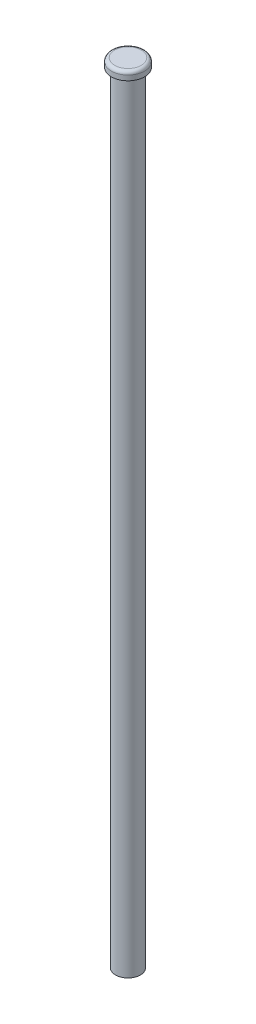
ISO-10303-21;
HEADER;
FILE_DESCRIPTION(('STEP AP214'),'2;1');
FILE_NAME('part.step','',(''),(''),'','','');
FILE_SCHEMA(('AUTOMOTIVE_DESIGN { 1 0 10303 214 1 1 1 1 }'));
ENDSEC;
DATA;
#1=APPLICATION_CONTEXT('core data for automotive mechanical design processes');
#2=APPLICATION_PROTOCOL_DEFINITION('international standard','automotive_design',2000,#1);
#3=PRODUCT_CONTEXT('',#1,'mechanical');
#4=PRODUCT('Part','Part','',(#3));
#5=PRODUCT_RELATED_PRODUCT_CATEGORY('part','',(#4));
#6=PRODUCT_DEFINITION_FORMATION('','',#4);
#7=PRODUCT_DEFINITION_CONTEXT('part definition',#1,'design');
#8=PRODUCT_DEFINITION('design','',#6,#7);
#9=PRODUCT_DEFINITION_SHAPE('','',#8);
#10=(LENGTH_UNIT() NAMED_UNIT(*) SI_UNIT(.MILLI.,.METRE.));
#11=(NAMED_UNIT(*) PLANE_ANGLE_UNIT() SI_UNIT($,.RADIAN.));
#12=(NAMED_UNIT(*) SI_UNIT($,.STERADIAN.) SOLID_ANGLE_UNIT());
#13=UNCERTAINTY_MEASURE_WITH_UNIT(LENGTH_MEASURE(1.E-05),#10,'distance_accuracy_value','');
#14=(GEOMETRIC_REPRESENTATION_CONTEXT(3) GLOBAL_UNCERTAINTY_ASSIGNED_CONTEXT((#13)) GLOBAL_UNIT_ASSIGNED_CONTEXT((#10,
#11,#12)) REPRESENTATION_CONTEXT('',''));
#15=CARTESIAN_POINT('',(0.,0.,0.));
#16=DIRECTION('',(0.,0.,1.));
#17=DIRECTION('',(1.,0.,0.));
#18=AXIS2_PLACEMENT_3D('',#15,#16,#17);
#19=CARTESIAN_POINT('',(0.,94.,0.));
#20=DIRECTION('',(0.,-1.,0.));
#21=DIRECTION('',(0.,0.,-1.));
#22=AXIS2_PLACEMENT_3D('',#19,#20,#21);
#23=CYLINDRICAL_SURFACE('',#22,1.5);
#24=CARTESIAN_POINT('',(0.,94.,0.));
#25=DIRECTION('',(0.,1.,0.));
#26=DIRECTION('',(0.,0.,1.));
#27=AXIS2_PLACEMENT_3D('',#24,#25,#26);
#28=CIRCLE('',#27,1.5);
#29=CARTESIAN_POINT('',(0.,94.,1.5));
#30=VERTEX_POINT('',#29);
#31=EDGE_CURVE('E42',#30,#30,#28,.T.);
#32=ORIENTED_EDGE('',*,*,#31,.F.);
#33=EDGE_LOOP('',(#32));
#34=FACE_BOUND('',#33,.T.);
#35=CARTESIAN_POINT('',(0.,0.,0.));
#36=DIRECTION('',(0.,1.,0.));
#37=DIRECTION('',(0.,0.,1.));
#38=AXIS2_PLACEMENT_3D('',#35,#36,#37);
#39=CIRCLE('',#38,1.5);
#40=CARTESIAN_POINT('',(0.,0.,1.5));
#41=VERTEX_POINT('',#40);
#42=EDGE_CURVE('E46',#41,#41,#39,.T.);
#43=ORIENTED_EDGE('',*,*,#42,.T.);
#44=EDGE_LOOP('',(#43));
#45=FACE_BOUND('',#44,.T.);
#46=ADVANCED_FACE('F31',(#34,#45),#23,.T.);
#47=CARTESIAN_POINT('',(0.,0.,0.));
#48=DIRECTION('',(0.,1.,0.));
#49=DIRECTION('',(0.,0.,1.));
#50=AXIS2_PLACEMENT_3D('',#47,#48,#49);
#51=PLANE('',#50);
#52=ORIENTED_EDGE('',*,*,#42,.F.);
#53=EDGE_LOOP('',(#52));
#54=FACE_BOUND('',#53,.T.);
#55=ADVANCED_FACE('F71',(#54),#51,.F.);
#56=CARTESIAN_POINT('',(0.,95.,0.));
#57=DIRECTION('',(0.,-1.,0.));
#58=DIRECTION('',(0.,0.,-1.));
#59=AXIS2_PLACEMENT_3D('',#56,#57,#58);
#60=CYLINDRICAL_SURFACE('',#59,2.);
#61=CARTESIAN_POINT('',(0.,94.6,0.));
#62=DIRECTION('',(0.,1.,0.));
#63=DIRECTION('',(0.,0.,1.));
#64=AXIS2_PLACEMENT_3D('',#61,#62,#63);
#65=CIRCLE('',#64,2.);
#66=CARTESIAN_POINT('',(0.,94.6,2.));
#67=VERTEX_POINT('',#66);
#68=EDGE_CURVE('E10',#67,#67,#65,.F.);
#69=ORIENTED_EDGE('',*,*,#68,.T.);
#70=EDGE_LOOP('',(#69));
#71=FACE_BOUND('',#70,.T.);
#72=CARTESIAN_POINT('',(0.,94.,0.));
#73=DIRECTION('',(0.,1.,0.));
#74=DIRECTION('',(0.,0.,1.));
#75=AXIS2_PLACEMENT_3D('',#72,#73,#74);
#76=CIRCLE('',#75,2.);
#77=CARTESIAN_POINT('',(0.,94.,2.));
#78=VERTEX_POINT('',#77);
#79=EDGE_CURVE('E50',#78,#78,#76,.T.);
#80=ORIENTED_EDGE('',*,*,#79,.T.);
#81=EDGE_LOOP('',(#80));
#82=FACE_BOUND('',#81,.T.);
#83=ADVANCED_FACE('F55',(#71,#82),#60,.T.);
#84=CARTESIAN_POINT('',(0.,95.,0.));
#85=DIRECTION('',(0.,1.,0.));
#86=DIRECTION('',(0.,0.,1.));
#87=AXIS2_PLACEMENT_3D('',#84,#85,#86);
#88=PLANE('',#87);
#89=CARTESIAN_POINT('',(0.,95.,0.));
#90=DIRECTION('',(0.,1.,0.));
#91=DIRECTION('',(0.,0.,1.));
#92=AXIS2_PLACEMENT_3D('',#89,#90,#91);
#93=CIRCLE('',#92,1.6);
#94=CARTESIAN_POINT('',(0.,95.,1.6));
#95=VERTEX_POINT('',#94);
#96=EDGE_CURVE('E38',#95,#95,#93,.T.);
#97=ORIENTED_EDGE('',*,*,#96,.T.);
#98=EDGE_LOOP('',(#97));
#99=FACE_BOUND('',#98,.T.);
#100=ADVANCED_FACE('F59',(#99),#88,.T.);
#101=CARTESIAN_POINT('',(0.,94.,0.));
#102=DIRECTION('',(0.,1.,0.));
#103=DIRECTION('',(0.,0.,1.));
#104=AXIS2_PLACEMENT_3D('',#101,#102,#103);
#105=PLANE('',#104);
#106=ORIENTED_EDGE('',*,*,#31,.T.);
#107=EDGE_LOOP('',(#106));
#108=FACE_BOUND('',#107,.T.);
#109=ORIENTED_EDGE('',*,*,#79,.F.);
#110=EDGE_LOOP('',(#109));
#111=FACE_BOUND('',#110,.T.);
#112=ADVANCED_FACE('F57',(#108,#111),#105,.F.);
#113=CARTESIAN_POINT('',(0.,94.6,0.));
#114=DIRECTION('',(0.,1.,0.));
#115=DIRECTION('',(0.,0.,1.));
#116=AXIS2_PLACEMENT_3D('',#113,#114,#115);
#117=TOROIDAL_SURFACE('',#116,1.6,0.4);
#118=ORIENTED_EDGE('',*,*,#68,.F.);
#119=EDGE_LOOP('',(#118));
#120=FACE_BOUND('',#119,.T.);
#121=ORIENTED_EDGE('',*,*,#96,.F.);
#122=EDGE_LOOP('',(#121));
#123=FACE_BOUND('',#122,.T.);
#124=ADVANCED_FACE('F33',(#120,#123),#117,.T.);
#125=CLOSED_SHELL('',(#46,#55,#83,#100,#112,#124));
#126=MANIFOLD_SOLID_BREP('B2',#125);
#127=ADVANCED_BREP_SHAPE_REPRESENTATION('',(#18,#126),#14);
#128=SHAPE_DEFINITION_REPRESENTATION(#9,#127);
ENDSEC;
END-ISO-10303-21;
